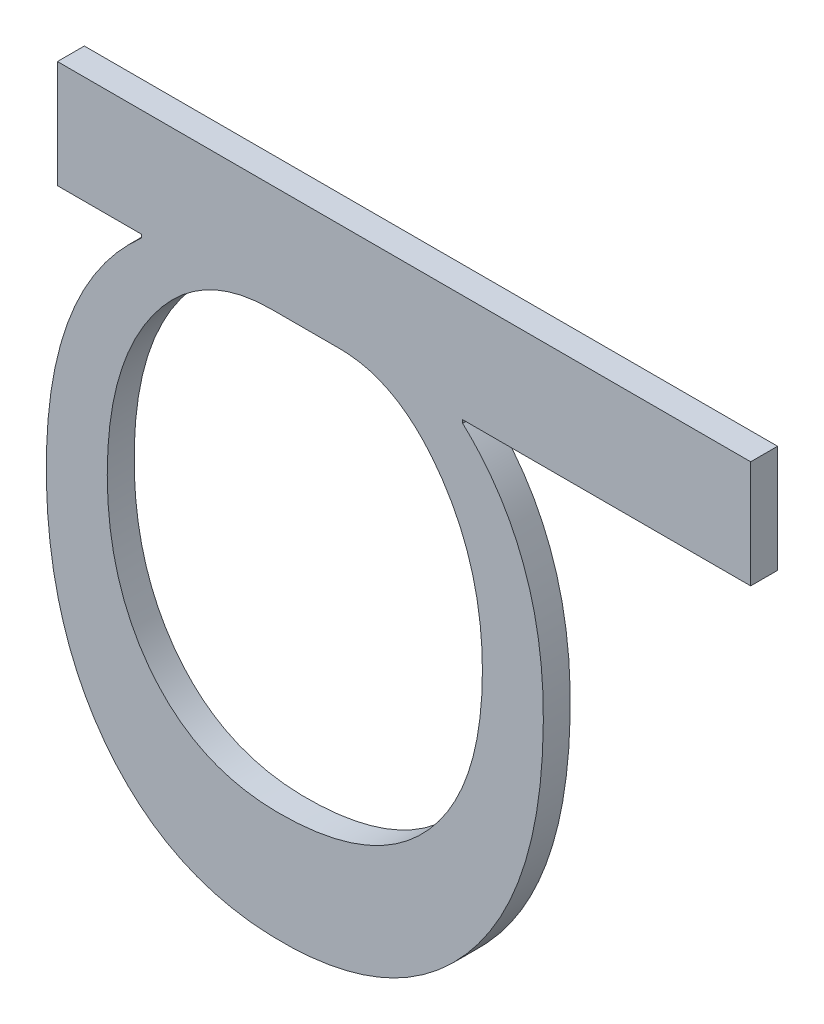
ISO-10303-21;
HEADER;
FILE_DESCRIPTION(('STEP AP214'),'2;1');
FILE_NAME('part.step','',(''),(''),'','','');
FILE_SCHEMA(('AUTOMOTIVE_DESIGN { 1 0 10303 214 1 1 1 1 }'));
ENDSEC;
DATA;
#1=APPLICATION_CONTEXT('core data for automotive mechanical design processes');
#2=APPLICATION_PROTOCOL_DEFINITION('international standard','automotive_design',2000,#1);
#3=PRODUCT_CONTEXT('',#1,'mechanical');
#4=PRODUCT('Part','Part','',(#3));
#5=PRODUCT_RELATED_PRODUCT_CATEGORY('part','',(#4));
#6=PRODUCT_DEFINITION_FORMATION('','',#4);
#7=PRODUCT_DEFINITION_CONTEXT('part definition',#1,'design');
#8=PRODUCT_DEFINITION('design','',#6,#7);
#9=PRODUCT_DEFINITION_SHAPE('','',#8);
#10=(LENGTH_UNIT() NAMED_UNIT(*) SI_UNIT(.MILLI.,.METRE.));
#11=(NAMED_UNIT(*) PLANE_ANGLE_UNIT() SI_UNIT($,.RADIAN.));
#12=(NAMED_UNIT(*) SI_UNIT($,.STERADIAN.) SOLID_ANGLE_UNIT());
#13=UNCERTAINTY_MEASURE_WITH_UNIT(LENGTH_MEASURE(1.E-05),#10,'distance_accuracy_value','');
#14=(GEOMETRIC_REPRESENTATION_CONTEXT(3) GLOBAL_UNCERTAINTY_ASSIGNED_CONTEXT((#13)) GLOBAL_UNIT_ASSIGNED_CONTEXT((#10,
#11,#12)) REPRESENTATION_CONTEXT('',''));
#15=CARTESIAN_POINT('',(0.,0.,0.));
#16=DIRECTION('',(0.,0.,1.));
#17=DIRECTION('',(1.,0.,0.));
#18=AXIS2_PLACEMENT_3D('',#15,#16,#17);
#19=CARTESIAN_POINT('',(-8.95983005625009,-22.770458436575,135.210489149433));
#20=DIRECTION('',(0.,0.,-1.));
#21=DIRECTION('',(0.,-1.,0.));
#22=AXIS2_PLACEMENT_3D('',#19,#20,#21);
#23=PLANE('',#22);
#24=DIRECTION('',(1.,0.,0.));
#25=VECTOR('',#24,1.);
#26=CARTESIAN_POINT('',(2.66453525910038E-13,24.9187466733,135.210489149433));
#27=LINE('',#26,#25);
#28=CARTESIAN_POINT('',(-7.19032697632218,24.9187466733,135.210489149433));
#29=VERTEX_POINT('',#28);
#30=CARTESIAN_POINT('',(-3.97696685012026,24.9187466733,135.210489149433));
#31=VERTEX_POINT('',#30);
#32=EDGE_CURVE('E48',#29,#31,#27,.T.);
#33=ORIENTED_EDGE('',*,*,#32,.T.);
#34=DIRECTION('',(0.,1.,0.));
#35=VECTOR('',#34,1.);
#36=CARTESIAN_POINT('',(-3.97696685012026,5.40908312699247,135.210489149433));
#37=LINE('',#36,#35);
#38=CARTESIAN_POINT('',(-3.97696685012026,26.1183691943336,135.210489149433));
#39=VERTEX_POINT('',#38);
#40=EDGE_CURVE('E54',#31,#39,#37,.T.);
#41=ORIENTED_EDGE('',*,*,#40,.T.);
#42=DIRECTION('',(-1.,0.,0.));
#43=VECTOR('',#42,1.);
#44=CARTESIAN_POINT('',(2.66453525910038E-13,26.1183691943336,135.210489149433));
#45=LINE('',#44,#43);
#46=CARTESIAN_POINT('',(-11.7110601493991,26.1183691943336,135.210489149433));
#47=VERTEX_POINT('',#46);
#48=EDGE_CURVE('E134',#39,#47,#45,.T.);
#49=ORIENTED_EDGE('',*,*,#48,.T.);
#50=DIRECTION('',(0.,-1.,0.));
#51=VECTOR('',#50,1.);
#52=CARTESIAN_POINT('',(-11.7110601493991,5.40908312699247,135.210489149433));
#53=LINE('',#52,#51);
#54=CARTESIAN_POINT('',(-11.7110601493991,24.9187466733,135.210489149433));
#55=VERTEX_POINT('',#54);
#56=EDGE_CURVE('E122',#47,#55,#53,.T.);
#57=ORIENTED_EDGE('',*,*,#56,.T.);
#58=DIRECTION('',(1.,0.,0.));
#59=VECTOR('',#58,1.);
#60=CARTESIAN_POINT('',(2.66453525910038E-13,24.9187466733,135.210489149433));
#61=LINE('',#60,#59);
#62=CARTESIAN_POINT('',(-10.7724333465145,24.9187466733,135.210489149433));
#63=VERTEX_POINT('',#62);
#64=EDGE_CURVE('E154',#55,#63,#61,.T.);
#65=ORIENTED_EDGE('',*,*,#64,.T.);
#66=DIRECTION('',(0.,-1.,0.));
#67=VECTOR('',#66,1.);
#68=CARTESIAN_POINT('',(-10.7724333465145,5.40908312699247,135.210489149433));
#69=LINE('',#68,#67);
#70=CARTESIAN_POINT('',(-10.7724333465145,24.882829831353,135.210489149433));
#71=VERTEX_POINT('',#70);
#72=EDGE_CURVE('E155',#63,#71,#69,.T.);
#73=ORIENTED_EDGE('',*,*,#72,.T.);
#74=CARTESIAN_POINT('',(-10.7724333465145,24.882829831353,135.210489149433));
#75=CARTESIAN_POINT('',(-11.4811923609376,24.2554824188768,135.210489149433));
#76=CARTESIAN_POINT('',(-11.8355718681491,23.338405627627,135.210489149433));
#77=CARTESIAN_POINT('',(-11.8355718681491,21.121139438492,135.210489149433));
#78=CARTESIAN_POINT('',(-11.6001172669569,20.3237851434588,135.210489149433));
#79=CARTESIAN_POINT('',(-10.6582974796157,19.1552911429867,135.210489149433));
#80=CARTESIAN_POINT('',(-10.0205741217549,18.8631666086159,135.210489149433));
#81=CARTESIAN_POINT('',(-8.33487700637026,18.863167682217,135.210489149433));
#82=CARTESIAN_POINT('',(-7.62691581837719,19.1900110856516,135.210489149433));
#83=CARTESIAN_POINT('',(-6.55739215658717,20.4973834296101,135.210489149433));
#84=CARTESIAN_POINT('',(-6.29001147151449,21.3821353437079,135.210489149433));
#85=CARTESIAN_POINT('',(-6.29001147151449,23.5323565741413,135.210489149433));
#86=CARTESIAN_POINT('',(-6.59011688920624,24.327316102771,135.210489149433));
#87=CARTESIAN_POINT('',(-7.19032697632218,24.882829831353,135.210489149433));
#88=(BOUNDED_CURVE() B_SPLINE_CURVE(3,(#74,#75,#76,#77,#78,#79,#80,#81,#82,#83,#84,#85,#86,#87),
.UNSPECIFIED.,.F.,.F.) B_SPLINE_CURVE_WITH_KNOTS((4,2,2,2,2,2,4),(0.,0.186607926762102,
0.342855021081848,0.49910207330936,0.670229816207461,0.841357743121363,1.),
.UNSPECIFIED.) CURVE() GEOMETRIC_REPRESENTATION_ITEM() RATIONAL_B_SPLINE_CURVE((1.,1.,1.,1.,1.,
1.,1.,1.,1.,1.,1.,1.,1.,1.)) REPRESENTATION_ITEM(''));
#89=CARTESIAN_POINT('',(-7.19032697632218,24.882829831353,135.210489149433));
#90=VERTEX_POINT('',#89);
#91=EDGE_CURVE('E11',#71,#90,#88,.T.);
#92=ORIENTED_EDGE('',*,*,#91,.T.);
#93=DIRECTION('',(0.,1.,0.));
#94=VECTOR('',#93,1.);
#95=CARTESIAN_POINT('',(-7.19032697632218,5.40908312699247,135.210489149433));
#96=LINE('',#95,#94);
#97=EDGE_CURVE('E165',#90,#29,#96,.T.);
#98=ORIENTED_EDGE('',*,*,#97,.T.);
#99=EDGE_LOOP('',(#33,#41,#49,#57,#65,#73,#92,#98));
#100=FACE_BOUND('',#99,.T.);
#101=CARTESIAN_POINT('',(-6.97003701237988,22.6057021132871,135.210489149433));
#102=CARTESIAN_POINT('',(-6.97003701237988,21.8251095406553,135.210489149433));
#103=CARTESIAN_POINT('',(-7.17117104828627,21.2109312927095,135.210489149433));
#104=CARTESIAN_POINT('',(-7.97570858689911,20.3154051378785,135.210489149433));
#105=CARTESIAN_POINT('',(-8.53122240901458,20.0915224493694,135.210489149433));
#106=CARTESIAN_POINT('',(-9.8369990270917,20.0915236768084,135.210489149433));
#107=CARTESIAN_POINT('',(-10.305515176333,20.3022353779087,135.210489149433));
#108=CARTESIAN_POINT('',(-10.9855395679336,21.1450841868568,135.210489149433));
#109=CARTESIAN_POINT('',(-11.1555466866488,21.7053869212319,135.210489149433));
#110=CARTESIAN_POINT('',(-11.1555459531499,23.1324825875304,135.210489149433));
#111=CARTESIAN_POINT('',(-10.9839434968293,23.733491428582,135.210489149433));
#112=CARTESIAN_POINT('',(-10.2975326313468,24.6816955164491,135.210489149433));
#113=CARTESIAN_POINT('',(-9.85934715959198,24.9187466733,135.210489149433));
#114=CARTESIAN_POINT('',(-9.0707732214423,24.9187466733,135.210489149433));
#115=CARTESIAN_POINT('',(-8.81536459877397,24.9187466733,135.210489149433));
#116=CARTESIAN_POINT('',(-8.11618309709198,24.9187466733,135.210489149433));
#117=CARTESIAN_POINT('',(-7.74025361599626,24.6960621624114,135.210489149433));
#118=CARTESIAN_POINT('',(-7.12408060615335,23.8053248535398,135.210489149433));
#119=CARTESIAN_POINT('',(-6.97003701237988,23.2569944933472,135.210489149433));
#120=CARTESIAN_POINT('',(-6.97003701237988,22.6057021132871,135.210489149433));
#121=(BOUNDED_CURVE() B_SPLINE_CURVE(3,(#101,#102,#103,#104,#105,#106,#107,#108,#109,#110,#111,
#112,#113,#114,#115,#116,#117,#118,#119,#120),.UNSPECIFIED.,.T.,
.F.) B_SPLINE_CURVE_WITH_KNOTS((4,2,2,2,2,2,2,2,2,4),(0.,0.136638925353513,0.27327775593979,
0.388374412813432,0.503471205427693,0.623298083400434,0.743125097738412,0.800527280141993,
0.900263661321193,1.),
.UNSPECIFIED.) CURVE() GEOMETRIC_REPRESENTATION_ITEM() RATIONAL_B_SPLINE_CURVE((1.,1.,1.,1.,1.,
1.,1.,1.,1.,1.,1.,1.,1.,1.,1.,1.,1.,1.,1.,1.)) REPRESENTATION_ITEM(''));
#122=CARTESIAN_POINT('',(-6.97003701237988,22.6057021132871,135.210489149433));
#123=VERTEX_POINT('',#122);
#124=EDGE_CURVE('E89',#123,#123,#121,.T.);
#125=ORIENTED_EDGE('',*,*,#124,.T.);
#126=EDGE_LOOP('',(#125));
#127=FACE_BOUND('',#126,.T.);
#128=ADVANCED_FACE('F43',(#100,#127),#23,.F.);
#129=CARTESIAN_POINT('',(-10.7724333465145,24.882829831353,135.410489149433));
#130=CARTESIAN_POINT('',(-11.4811923609376,24.2554824188768,135.410489149433));
#131=CARTESIAN_POINT('',(-11.8355718681491,23.338405627627,135.410489149433));
#132=CARTESIAN_POINT('',(-11.8355718681491,21.121139438492,135.410489149433));
#133=CARTESIAN_POINT('',(-11.6001172669569,20.3237851434588,135.410489149433));
#134=CARTESIAN_POINT('',(-10.6582974796157,19.1552911429867,135.410489149433));
#135=CARTESIAN_POINT('',(-10.0205741217549,18.8631666086159,135.410489149433));
#136=CARTESIAN_POINT('',(-8.33487700637026,18.863167682217,135.410489149433));
#137=CARTESIAN_POINT('',(-7.62691581837719,19.1900110856516,135.410489149433));
#138=CARTESIAN_POINT('',(-6.55739215658717,20.4973834296101,135.410489149433));
#139=CARTESIAN_POINT('',(-6.29001147151449,21.3821353437079,135.410489149433));
#140=CARTESIAN_POINT('',(-6.29001147151449,23.5323565741413,135.410489149433));
#141=CARTESIAN_POINT('',(-6.59011688920624,24.327316102771,135.410489149433));
#142=CARTESIAN_POINT('',(-7.19032697632218,24.882829831353,135.410489149433));
#143=(BOUNDED_CURVE() B_SPLINE_CURVE(3,(#129,#130,#131,#132,#133,#134,#135,#136,#137,#138,#139,
#140,#141,#142),.UNSPECIFIED.,.F.,.F.) B_SPLINE_CURVE_WITH_KNOTS((4,2,2,2,2,2,4),(0.,
0.186607926762102,0.342855021081848,0.49910207330936,0.670229816207461,0.841357743121363,1.),
.UNSPECIFIED.) CURVE() GEOMETRIC_REPRESENTATION_ITEM() RATIONAL_B_SPLINE_CURVE((1.,1.,1.,1.,1.,
1.,1.,1.,1.,1.,1.,1.,1.,1.)) REPRESENTATION_ITEM(''));
#144=DIRECTION('',(0.,0.,-1.));
#145=VECTOR('',#144,1.);
#146=SURFACE_OF_LINEAR_EXTRUSION('',#143,#145);
#147=ORIENTED_EDGE('',*,*,#91,.F.);
#148=CARTESIAN_POINT('',(-10.7724333465145,24.882829831353,134.910489149433));
#149=CARTESIAN_POINT('',(-10.7724333465145,24.882829831353,135.010489149433));
#150=CARTESIAN_POINT('',(-10.7724333465145,24.882829831353,135.110489149433));
#151=CARTESIAN_POINT('',(-10.7724333465145,24.882829831353,135.210489149433));
#152=(BOUNDED_CURVE() B_SPLINE_CURVE(3,(#148,#149,#150,#151),.UNSPECIFIED.,.F.,
.F.) B_SPLINE_CURVE_WITH_KNOTS((4,4),(0.,1.),
.UNSPECIFIED.) CURVE() GEOMETRIC_REPRESENTATION_ITEM() RATIONAL_B_SPLINE_CURVE((1.,1.,1.,1.)) REPRESENTATION_ITEM(''));
#153=CARTESIAN_POINT('',(-10.7724333465145,24.882829831353,134.910489149433));
#154=VERTEX_POINT('',#153);
#155=EDGE_CURVE('E160',#154,#71,#152,.T.);
#156=ORIENTED_EDGE('',*,*,#155,.F.);
#157=CARTESIAN_POINT('',(-7.19032697632218,24.882829831353,134.910489149433));
#158=CARTESIAN_POINT('',(-6.59011688920624,24.327316102771,134.910489149433));
#159=CARTESIAN_POINT('',(-6.29001147151449,23.5323565741413,134.910489149433));
#160=CARTESIAN_POINT('',(-6.29001147151449,21.3821353437079,134.910489149433));
#161=CARTESIAN_POINT('',(-6.55739215658717,20.4973834296101,134.910489149433));
#162=CARTESIAN_POINT('',(-7.62691581837719,19.1900110856516,134.910489149433));
#163=CARTESIAN_POINT('',(-8.33487700637026,18.863167682217,134.910489149433));
#164=CARTESIAN_POINT('',(-10.0205741217549,18.8631666086159,134.910489149433));
#165=CARTESIAN_POINT('',(-10.6582974796157,19.1552911429867,134.910489149433));
#166=CARTESIAN_POINT('',(-11.6001172669569,20.3237851434588,134.910489149433));
#167=CARTESIAN_POINT('',(-11.8355718681491,21.121139438492,134.910489149433));
#168=CARTESIAN_POINT('',(-11.8355718681491,23.338405627627,134.910489149433));
#169=CARTESIAN_POINT('',(-11.4811923609376,24.2554824188768,134.910489149433));
#170=CARTESIAN_POINT('',(-10.7724333465145,24.882829831353,134.910489149433));
#171=(BOUNDED_CURVE() B_SPLINE_CURVE(3,(#157,#158,#159,#160,#161,#162,#163,#164,#165,#166,#167,
#168,#169,#170),.UNSPECIFIED.,.F.,.F.) B_SPLINE_CURVE_WITH_KNOTS((4,2,2,2,2,2,4),(0.,
0.158642256878637,0.329770183792539,0.50089792669064,0.657144978918152,0.813392073237898,1.),
.UNSPECIFIED.) CURVE() GEOMETRIC_REPRESENTATION_ITEM() RATIONAL_B_SPLINE_CURVE((1.,1.,1.,1.,1.,
1.,1.,1.,1.,1.,1.,1.,1.,1.)) REPRESENTATION_ITEM(''));
#172=CARTESIAN_POINT('',(-7.19032697632218,24.882829831353,134.910489149433));
#173=VERTEX_POINT('',#172);
#174=EDGE_CURVE('E203',#173,#154,#171,.T.);
#175=ORIENTED_EDGE('',*,*,#174,.F.);
#176=CARTESIAN_POINT('',(-7.19032697632218,24.882829831353,135.210489149433));
#177=CARTESIAN_POINT('',(-7.19032697632218,24.882829831353,135.110489149433));
#178=CARTESIAN_POINT('',(-7.19032697632218,24.882829831353,135.010489149433));
#179=CARTESIAN_POINT('',(-7.19032697632218,24.882829831353,134.910489149433));
#180=(BOUNDED_CURVE() B_SPLINE_CURVE(3,(#176,#177,#178,#179),.UNSPECIFIED.,.F.,
.F.) B_SPLINE_CURVE_WITH_KNOTS((4,4),(0.,1.),
.UNSPECIFIED.) CURVE() GEOMETRIC_REPRESENTATION_ITEM() RATIONAL_B_SPLINE_CURVE((1.,1.,1.,1.)) REPRESENTATION_ITEM(''));
#181=EDGE_CURVE('E191',#90,#173,#180,.T.);
#182=ORIENTED_EDGE('',*,*,#181,.F.);
#183=EDGE_LOOP('',(#147,#156,#175,#182));
#184=FACE_BOUND('',#183,.T.);
#185=ADVANCED_FACE('F45',(#184),#146,.F.);
#186=CARTESIAN_POINT('',(-3.97696685012026,26.1183691943336,135.410489149433));
#187=DIRECTION('',(1.,0.,0.));
#188=DIRECTION('',(0.,1.,0.));
#189=AXIS2_PLACEMENT_3D('',#186,#187,#188);
#190=PLANE('',#189);
#191=ORIENTED_EDGE('',*,*,#40,.F.);
#192=CARTESIAN_POINT('',(-3.97696685012026,24.9187466733001,135.210489149433));
#193=CARTESIAN_POINT('',(-3.97696685012026,24.9187466733001,135.110489149433));
#194=CARTESIAN_POINT('',(-3.97696685012026,24.9187466733001,135.010489149433));
#195=CARTESIAN_POINT('',(-3.97696685012026,24.9187466733001,134.910489149433));
#196=(BOUNDED_CURVE() B_SPLINE_CURVE(3,(#192,#193,#194,#195),.UNSPECIFIED.,.F.,
.F.) B_SPLINE_CURVE_WITH_KNOTS((4,4),(0.,1.),
.UNSPECIFIED.) CURVE() GEOMETRIC_REPRESENTATION_ITEM() RATIONAL_B_SPLINE_CURVE((1.,1.,1.,1.)) REPRESENTATION_ITEM(''));
#197=CARTESIAN_POINT('',(-3.97696685012026,24.9187466733,134.910489149433));
#198=VERTEX_POINT('',#197);
#199=EDGE_CURVE('E202',#31,#198,#196,.T.);
#200=ORIENTED_EDGE('',*,*,#199,.T.);
#201=CARTESIAN_POINT('',(-3.97696685012026,26.1183691943336,134.910489149433));
#202=CARTESIAN_POINT('',(-3.97696685012026,25.7184950206559,134.910489149433));
#203=CARTESIAN_POINT('',(-3.97696685012026,25.318620846978,134.910489149433));
#204=CARTESIAN_POINT('',(-3.97696685012026,24.9187466733,134.910489149433));
#205=(BOUNDED_CURVE() B_SPLINE_CURVE(3,(#201,#202,#203,#204),.UNSPECIFIED.,.F.,
.F.) B_SPLINE_CURVE_WITH_KNOTS((4,4),(0.,1.),
.UNSPECIFIED.) CURVE() GEOMETRIC_REPRESENTATION_ITEM() RATIONAL_B_SPLINE_CURVE((1.,1.,1.,1.)) REPRESENTATION_ITEM(''));
#206=CARTESIAN_POINT('',(-3.97696685012026,26.1183691943336,134.910489149433));
#207=VERTEX_POINT('',#206);
#208=EDGE_CURVE('E176',#207,#198,#205,.T.);
#209=ORIENTED_EDGE('',*,*,#208,.F.);
#210=CARTESIAN_POINT('',(-3.97696685012026,26.1183691943336,135.210489149433));
#211=CARTESIAN_POINT('',(-3.97696685012026,26.1183691943336,135.110489149433));
#212=CARTESIAN_POINT('',(-3.97696685012026,26.1183691943336,135.010489149433));
#213=CARTESIAN_POINT('',(-3.97696685012026,26.1183691943336,134.910489149433));
#214=(BOUNDED_CURVE() B_SPLINE_CURVE(3,(#210,#211,#212,#213),.UNSPECIFIED.,.F.,
.F.) B_SPLINE_CURVE_WITH_KNOTS((4,4),(0.,1.),
.UNSPECIFIED.) CURVE() GEOMETRIC_REPRESENTATION_ITEM() RATIONAL_B_SPLINE_CURVE((1.,1.,1.,1.)) REPRESENTATION_ITEM(''));
#215=EDGE_CURVE('E126',#39,#207,#214,.T.);
#216=ORIENTED_EDGE('',*,*,#215,.F.);
#217=EDGE_LOOP('',(#191,#200,#209,#216));
#218=FACE_BOUND('',#217,.T.);
#219=ADVANCED_FACE('F287',(#218),#190,.T.);
#220=CARTESIAN_POINT('',(-3.97696685012026,24.9187466733,135.410489149433));
#221=DIRECTION('',(0.,-1.,0.));
#222=DIRECTION('',(0.,0.,-1.));
#223=AXIS2_PLACEMENT_3D('',#220,#221,#222);
#224=PLANE('',#223);
#225=ORIENTED_EDGE('',*,*,#32,.F.);
#226=CARTESIAN_POINT('',(-7.19032697632218,24.9187466733,135.210489149433));
#227=CARTESIAN_POINT('',(-7.19032697632218,24.9187466733,135.110489149433));
#228=CARTESIAN_POINT('',(-7.19032697632218,24.9187466733,135.010489149433));
#229=CARTESIAN_POINT('',(-7.19032697632218,24.9187466733,134.910489149433));
#230=(BOUNDED_CURVE() B_SPLINE_CURVE(3,(#226,#227,#228,#229),.UNSPECIFIED.,.F.,
.F.) B_SPLINE_CURVE_WITH_KNOTS((4,4),(0.,1.),
.UNSPECIFIED.) CURVE() GEOMETRIC_REPRESENTATION_ITEM() RATIONAL_B_SPLINE_CURVE((1.,1.,1.,1.)) REPRESENTATION_ITEM(''));
#231=CARTESIAN_POINT('',(-7.19032697632218,24.9187466733,134.910489149433));
#232=VERTEX_POINT('',#231);
#233=EDGE_CURVE('E184',#29,#232,#230,.T.);
#234=ORIENTED_EDGE('',*,*,#233,.T.);
#235=CARTESIAN_POINT('',(-3.97696685012026,24.9187466733,134.910489149433));
#236=CARTESIAN_POINT('',(-5.04808689218757,24.9187466733,134.910489149433));
#237=CARTESIAN_POINT('',(-6.11920693425488,24.9187466733,134.910489149433));
#238=CARTESIAN_POINT('',(-7.19032697632218,24.9187466733,134.910489149433));
#239=(BOUNDED_CURVE() B_SPLINE_CURVE(3,(#235,#236,#237,#238),.UNSPECIFIED.,.F.,
.F.) B_SPLINE_CURVE_WITH_KNOTS((4,4),(0.,1.),
.UNSPECIFIED.) CURVE() GEOMETRIC_REPRESENTATION_ITEM() RATIONAL_B_SPLINE_CURVE((1.,1.,1.,1.)) REPRESENTATION_ITEM(''));
#240=EDGE_CURVE('E183',#198,#232,#239,.T.);
#241=ORIENTED_EDGE('',*,*,#240,.F.);
#242=ORIENTED_EDGE('',*,*,#199,.F.);
#243=EDGE_LOOP('',(#225,#234,#241,#242));
#244=FACE_BOUND('',#243,.T.);
#245=ADVANCED_FACE('F277',(#244),#224,.T.);
#246=CARTESIAN_POINT('',(-7.19032697632218,24.9187466733,135.410489149433));
#247=DIRECTION('',(1.,0.,0.));
#248=DIRECTION('',(0.,1.,0.));
#249=AXIS2_PLACEMENT_3D('',#246,#247,#248);
#250=PLANE('',#249);
#251=ORIENTED_EDGE('',*,*,#97,.F.);
#252=ORIENTED_EDGE('',*,*,#181,.T.);
#253=CARTESIAN_POINT('',(-7.19032697632218,24.9187466733,134.910489149433));
#254=CARTESIAN_POINT('',(-7.19032697632218,24.9067743926509,134.910489149433));
#255=CARTESIAN_POINT('',(-7.19032697632218,24.894802112002,134.910489149433));
#256=CARTESIAN_POINT('',(-7.19032697632218,24.882829831353,134.910489149433));
#257=(BOUNDED_CURVE() B_SPLINE_CURVE(3,(#253,#254,#255,#256),.UNSPECIFIED.,.F.,
.F.) B_SPLINE_CURVE_WITH_KNOTS((4,4),(0.,1.),
.UNSPECIFIED.) CURVE() GEOMETRIC_REPRESENTATION_ITEM() RATIONAL_B_SPLINE_CURVE((1.,1.,1.,1.)) REPRESENTATION_ITEM(''));
#258=EDGE_CURVE('E207',#232,#173,#257,.T.);
#259=ORIENTED_EDGE('',*,*,#258,.F.);
#260=ORIENTED_EDGE('',*,*,#233,.F.);
#261=EDGE_LOOP('',(#251,#252,#259,#260));
#262=FACE_BOUND('',#261,.T.);
#263=ADVANCED_FACE('F278',(#262),#250,.T.);
#264=CARTESIAN_POINT('',(-10.7724333465145,24.882829831353,135.410489149433));
#265=DIRECTION('',(-1.,0.,0.));
#266=DIRECTION('',(0.,0.,1.));
#267=AXIS2_PLACEMENT_3D('',#264,#265,#266);
#268=PLANE('',#267);
#269=ORIENTED_EDGE('',*,*,#72,.F.);
#270=CARTESIAN_POINT('',(-10.7724333465145,24.9187466733,135.210489149433));
#271=CARTESIAN_POINT('',(-10.7724333465145,24.9187466733,135.110489149433));
#272=CARTESIAN_POINT('',(-10.7724333465145,24.9187466733,135.010489149433));
#273=CARTESIAN_POINT('',(-10.7724333465145,24.9187466733,134.910489149433));
#274=(BOUNDED_CURVE() B_SPLINE_CURVE(3,(#270,#271,#272,#273),.UNSPECIFIED.,.F.,
.F.) B_SPLINE_CURVE_WITH_KNOTS((4,4),(0.,1.),
.UNSPECIFIED.) CURVE() GEOMETRIC_REPRESENTATION_ITEM() RATIONAL_B_SPLINE_CURVE((1.,1.,1.,1.)) REPRESENTATION_ITEM(''));
#275=CARTESIAN_POINT('',(-10.7724333465145,24.9187466733,134.910489149433));
#276=VERTEX_POINT('',#275);
#277=EDGE_CURVE('E161',#63,#276,#274,.T.);
#278=ORIENTED_EDGE('',*,*,#277,.T.);
#279=CARTESIAN_POINT('',(-10.7724333465145,24.882829831353,134.910489149433));
#280=CARTESIAN_POINT('',(-10.7724333465145,24.894802112002,134.910489149433));
#281=CARTESIAN_POINT('',(-10.7724333465145,24.9067743926509,134.910489149433));
#282=CARTESIAN_POINT('',(-10.7724333465145,24.9187466733,134.910489149433));
#283=(BOUNDED_CURVE() B_SPLINE_CURVE(3,(#279,#280,#281,#282),.UNSPECIFIED.,.F.,
.F.) B_SPLINE_CURVE_WITH_KNOTS((4,4),(0.,1.),
.UNSPECIFIED.) CURVE() GEOMETRIC_REPRESENTATION_ITEM() RATIONAL_B_SPLINE_CURVE((1.,1.,1.,1.)) REPRESENTATION_ITEM(''));
#284=EDGE_CURVE('E141',#154,#276,#283,.T.);
#285=ORIENTED_EDGE('',*,*,#284,.F.);
#286=ORIENTED_EDGE('',*,*,#155,.T.);
#287=EDGE_LOOP('',(#269,#278,#285,#286));
#288=FACE_BOUND('',#287,.T.);
#289=ADVANCED_FACE('F251',(#288),#268,.T.);
#290=CARTESIAN_POINT('',(-10.7724333465145,24.9187466733,135.410489149433));
#291=DIRECTION('',(0.,-1.,0.));
#292=DIRECTION('',(0.,0.,-1.));
#293=AXIS2_PLACEMENT_3D('',#290,#291,#292);
#294=PLANE('',#293);
#295=ORIENTED_EDGE('',*,*,#64,.F.);
#296=CARTESIAN_POINT('',(-11.7110601493991,24.9187466733,135.210489149433));
#297=CARTESIAN_POINT('',(-11.7110601493991,24.9187466733,135.110489149433));
#298=CARTESIAN_POINT('',(-11.7110601493991,24.9187466733,135.010489149433));
#299=CARTESIAN_POINT('',(-11.7110601493991,24.9187466733,134.910489149433));
#300=(BOUNDED_CURVE() B_SPLINE_CURVE(3,(#296,#297,#298,#299),.UNSPECIFIED.,.F.,
.F.) B_SPLINE_CURVE_WITH_KNOTS((4,4),(0.,1.),
.UNSPECIFIED.) CURVE() GEOMETRIC_REPRESENTATION_ITEM() RATIONAL_B_SPLINE_CURVE((1.,1.,1.,1.)) REPRESENTATION_ITEM(''));
#301=CARTESIAN_POINT('',(-11.7110601493991,24.9187466733,134.910489149433));
#302=VERTEX_POINT('',#301);
#303=EDGE_CURVE('E148',#55,#302,#300,.T.);
#304=ORIENTED_EDGE('',*,*,#303,.T.);
#305=CARTESIAN_POINT('',(-10.7724333465145,24.9187466733,134.910489149433));
#306=CARTESIAN_POINT('',(-11.085308947476,24.9187466733,134.910489149433));
#307=CARTESIAN_POINT('',(-11.3981845484376,24.9187466733,134.910489149433));
#308=CARTESIAN_POINT('',(-11.7110601493991,24.9187466733,134.910489149433));
#309=(BOUNDED_CURVE() B_SPLINE_CURVE(3,(#305,#306,#307,#308),.UNSPECIFIED.,.F.,
.F.) B_SPLINE_CURVE_WITH_KNOTS((4,4),(0.,1.),
.UNSPECIFIED.) CURVE() GEOMETRIC_REPRESENTATION_ITEM() RATIONAL_B_SPLINE_CURVE((1.,1.,1.,1.)) REPRESENTATION_ITEM(''));
#310=EDGE_CURVE('E139',#276,#302,#309,.T.);
#311=ORIENTED_EDGE('',*,*,#310,.F.);
#312=ORIENTED_EDGE('',*,*,#277,.F.);
#313=EDGE_LOOP('',(#295,#304,#311,#312));
#314=FACE_BOUND('',#313,.T.);
#315=ADVANCED_FACE('F249',(#314),#294,.T.);
#316=CARTESIAN_POINT('',(-11.7110601493991,24.9187466733,135.410489149433));
#317=DIRECTION('',(-1.,0.,0.));
#318=DIRECTION('',(0.,0.,1.));
#319=AXIS2_PLACEMENT_3D('',#316,#317,#318);
#320=PLANE('',#319);
#321=ORIENTED_EDGE('',*,*,#56,.F.);
#322=CARTESIAN_POINT('',(-11.7110601493991,26.1183691943336,135.210489149433));
#323=CARTESIAN_POINT('',(-11.7110601493991,26.1183691943336,135.110489149433));
#324=CARTESIAN_POINT('',(-11.7110601493991,26.1183691943336,135.010489149433));
#325=CARTESIAN_POINT('',(-11.7110601493991,26.1183691943336,134.910489149433));
#326=(BOUNDED_CURVE() B_SPLINE_CURVE(3,(#322,#323,#324,#325),.UNSPECIFIED.,.F.,
.F.) B_SPLINE_CURVE_WITH_KNOTS((4,4),(0.,1.),
.UNSPECIFIED.) CURVE() GEOMETRIC_REPRESENTATION_ITEM() RATIONAL_B_SPLINE_CURVE((1.,1.,1.,1.)) REPRESENTATION_ITEM(''));
#327=CARTESIAN_POINT('',(-11.7110601493991,26.1183691943336,134.910489149433));
#328=VERTEX_POINT('',#327);
#329=EDGE_CURVE('E114',#47,#328,#326,.T.);
#330=ORIENTED_EDGE('',*,*,#329,.T.);
#331=CARTESIAN_POINT('',(-11.7110601493991,24.9187466733,134.910489149433));
#332=CARTESIAN_POINT('',(-11.7110601493991,25.318620846978,134.910489149433));
#333=CARTESIAN_POINT('',(-11.7110601493991,25.7184950206559,134.910489149433));
#334=CARTESIAN_POINT('',(-11.7110601493991,26.1183691943336,134.910489149433));
#335=(BOUNDED_CURVE() B_SPLINE_CURVE(3,(#331,#332,#333,#334),.UNSPECIFIED.,.F.,
.F.) B_SPLINE_CURVE_WITH_KNOTS((4,4),(0.,1.),
.UNSPECIFIED.) CURVE() GEOMETRIC_REPRESENTATION_ITEM() RATIONAL_B_SPLINE_CURVE((1.,1.,1.,1.)) REPRESENTATION_ITEM(''));
#336=EDGE_CURVE('E119',#302,#328,#335,.T.);
#337=ORIENTED_EDGE('',*,*,#336,.F.);
#338=ORIENTED_EDGE('',*,*,#303,.F.);
#339=EDGE_LOOP('',(#321,#330,#337,#338));
#340=FACE_BOUND('',#339,.T.);
#341=ADVANCED_FACE('F116',(#340),#320,.T.);
#342=CARTESIAN_POINT('',(-11.7110601493991,26.1183691943336,135.410489149433));
#343=DIRECTION('',(0.,1.,0.));
#344=DIRECTION('',(1.,0.,0.));
#345=AXIS2_PLACEMENT_3D('',#342,#343,#344);
#346=PLANE('',#345);
#347=ORIENTED_EDGE('',*,*,#48,.F.);
#348=ORIENTED_EDGE('',*,*,#215,.T.);
#349=CARTESIAN_POINT('',(-11.7110601493991,26.1183691943336,134.910489149433));
#350=CARTESIAN_POINT('',(-9.13302904963949,26.1183691943336,134.910489149433));
#351=CARTESIAN_POINT('',(-6.55499794987988,26.1183691943336,134.910489149433));
#352=CARTESIAN_POINT('',(-3.97696685012026,26.1183691943336,134.910489149433));
#353=(BOUNDED_CURVE() B_SPLINE_CURVE(3,(#349,#350,#351,#352),.UNSPECIFIED.,.F.,
.F.) B_SPLINE_CURVE_WITH_KNOTS((4,4),(0.,1.),
.UNSPECIFIED.) CURVE() GEOMETRIC_REPRESENTATION_ITEM() RATIONAL_B_SPLINE_CURVE((1.,1.,1.,1.)) REPRESENTATION_ITEM(''));
#354=EDGE_CURVE('E129',#328,#207,#353,.T.);
#355=ORIENTED_EDGE('',*,*,#354,.F.);
#356=ORIENTED_EDGE('',*,*,#329,.F.);
#357=EDGE_LOOP('',(#347,#348,#355,#356));
#358=FACE_BOUND('',#357,.T.);
#359=ADVANCED_FACE('F130',(#358),#346,.T.);
#360=CARTESIAN_POINT('',(-9.20218057646048,18.8631941259579,134.910489149433));
#361=DIRECTION('',(0.,0.,1.));
#362=DIRECTION('',(1.,0.,0.));
#363=AXIS2_PLACEMENT_3D('',#360,#361,#362);
#364=PLANE('',#363);
#365=ORIENTED_EDGE('',*,*,#208,.T.);
#366=ORIENTED_EDGE('',*,*,#240,.T.);
#367=ORIENTED_EDGE('',*,*,#258,.T.);
#368=ORIENTED_EDGE('',*,*,#174,.T.);
#369=ORIENTED_EDGE('',*,*,#284,.T.);
#370=ORIENTED_EDGE('',*,*,#310,.T.);
#371=ORIENTED_EDGE('',*,*,#336,.T.);
#372=ORIENTED_EDGE('',*,*,#354,.T.);
#373=EDGE_LOOP('',(#365,#366,#367,#368,#369,#370,#371,#372));
#374=FACE_BOUND('',#373,.T.);
#375=CARTESIAN_POINT('',(-6.97003701237988,22.6057021132871,134.910489149433));
#376=CARTESIAN_POINT('',(-6.97003701237988,23.2569944933472,134.910489149433));
#377=CARTESIAN_POINT('',(-7.12408060615335,23.8053248535398,134.910489149433));
#378=CARTESIAN_POINT('',(-7.74025361599626,24.6960621624114,134.910489149433));
#379=CARTESIAN_POINT('',(-8.11618309709198,24.9187466733,134.910489149433));
#380=CARTESIAN_POINT('',(-8.81536459877397,24.9187466733,134.910489149433));
#381=CARTESIAN_POINT('',(-9.0707732214423,24.9187466733,134.910489149433));
#382=CARTESIAN_POINT('',(-9.85934715959198,24.9187466733,134.910489149433));
#383=CARTESIAN_POINT('',(-10.2975326313468,24.6816955164491,134.910489149433));
#384=CARTESIAN_POINT('',(-10.9839434968293,23.733491428582,134.910489149433));
#385=CARTESIAN_POINT('',(-11.1555459531499,23.1324825875304,134.910489149433));
#386=CARTESIAN_POINT('',(-11.1555466866488,21.7053869212319,134.910489149433));
#387=CARTESIAN_POINT('',(-10.9855395679336,21.1450841868568,134.910489149433));
#388=CARTESIAN_POINT('',(-10.305515176333,20.3022353779087,134.910489149433));
#389=CARTESIAN_POINT('',(-9.8369990270917,20.0915236768084,134.910489149433));
#390=CARTESIAN_POINT('',(-8.53122240901458,20.0915224493694,134.910489149433));
#391=CARTESIAN_POINT('',(-7.97570858689911,20.3154051378785,134.910489149433));
#392=CARTESIAN_POINT('',(-7.17117104828627,21.2109312927095,134.910489149433));
#393=CARTESIAN_POINT('',(-6.97003701237988,21.8251095406553,134.910489149433));
#394=CARTESIAN_POINT('',(-6.97003701237988,22.6057021132871,134.910489149433));
#395=(BOUNDED_CURVE() B_SPLINE_CURVE(3,(#375,#376,#377,#378,#379,#380,#381,#382,#383,#384,#385,
#386,#387,#388,#389,#390,#391,#392,#393,#394),.UNSPECIFIED.,.T.,
.F.) B_SPLINE_CURVE_WITH_KNOTS((4,2,2,2,2,2,2,2,2,4),(0.,0.099736338678807,0.199472719858007,
0.256874902261588,0.376701916599566,0.496528794572307,0.611625587186568,0.72672224406021,
0.863361074646487,1.),
.UNSPECIFIED.) CURVE() GEOMETRIC_REPRESENTATION_ITEM() RATIONAL_B_SPLINE_CURVE((1.,1.,1.,1.,1.,
1.,1.,1.,1.,1.,1.,1.,1.,1.,1.,1.,1.,1.,1.,1.)) REPRESENTATION_ITEM(''));
#396=CARTESIAN_POINT('',(-6.97003701237988,22.6057021132871,134.910489149433));
#397=VERTEX_POINT('',#396);
#398=EDGE_CURVE('E97',#397,#397,#395,.T.);
#399=ORIENTED_EDGE('',*,*,#398,.T.);
#400=EDGE_LOOP('',(#399));
#401=FACE_BOUND('',#400,.T.);
#402=ADVANCED_FACE('F136',(#374,#401),#364,.F.);
#403=CARTESIAN_POINT('',(-6.97003701237988,22.6057021132871,135.410489149433));
#404=CARTESIAN_POINT('',(-6.97003701237988,21.8251095406553,135.410489149433));
#405=CARTESIAN_POINT('',(-7.17117104828627,21.2109312927095,135.410489149433));
#406=CARTESIAN_POINT('',(-7.97570858689911,20.3154051378785,135.410489149433));
#407=CARTESIAN_POINT('',(-8.53122240901458,20.0915224493694,135.410489149433));
#408=CARTESIAN_POINT('',(-9.8369990270917,20.0915236768084,135.410489149433));
#409=CARTESIAN_POINT('',(-10.305515176333,20.3022353779087,135.410489149433));
#410=CARTESIAN_POINT('',(-10.9855395679336,21.1450841868568,135.410489149433));
#411=CARTESIAN_POINT('',(-11.1555466866488,21.7053869212319,135.410489149433));
#412=CARTESIAN_POINT('',(-11.1555459531499,23.1324825875304,135.410489149433));
#413=CARTESIAN_POINT('',(-10.9839434968293,23.733491428582,135.410489149433));
#414=CARTESIAN_POINT('',(-10.2975326313468,24.6816955164491,135.410489149433));
#415=CARTESIAN_POINT('',(-9.85934715959198,24.9187466733,135.410489149433));
#416=CARTESIAN_POINT('',(-9.0707732214423,24.9187466733,135.410489149433));
#417=CARTESIAN_POINT('',(-8.81536459877397,24.9187466733,135.410489149433));
#418=CARTESIAN_POINT('',(-8.11618309709198,24.9187466733,135.410489149433));
#419=CARTESIAN_POINT('',(-7.74025361599626,24.6960621624114,135.410489149433));
#420=CARTESIAN_POINT('',(-7.12408060615335,23.8053248535398,135.410489149433));
#421=CARTESIAN_POINT('',(-6.97003701237988,23.2569944933472,135.410489149433));
#422=CARTESIAN_POINT('',(-6.97003701237988,22.6057021132871,135.410489149433));
#423=(BOUNDED_CURVE() B_SPLINE_CURVE(3,(#403,#404,#405,#406,#407,#408,#409,#410,#411,#412,#413,
#414,#415,#416,#417,#418,#419,#420,#421,#422),.UNSPECIFIED.,.T.,
.F.) B_SPLINE_CURVE_WITH_KNOTS((4,2,2,2,2,2,2,2,2,4),(0.,0.136638925353513,0.27327775593979,
0.388374412813432,0.503471205427693,0.623298083400434,0.743125097738412,0.800527280141993,
0.900263661321193,1.),
.UNSPECIFIED.) CURVE() GEOMETRIC_REPRESENTATION_ITEM() RATIONAL_B_SPLINE_CURVE((1.,1.,1.,1.,1.,
1.,1.,1.,1.,1.,1.,1.,1.,1.,1.,1.,1.,1.,1.,1.)) REPRESENTATION_ITEM(''));
#424=DIRECTION('',(0.,0.,-1.));
#425=VECTOR('',#424,1.);
#426=SURFACE_OF_LINEAR_EXTRUSION('',#423,#425);
#427=ORIENTED_EDGE('',*,*,#124,.F.);
#428=EDGE_LOOP('',(#427));
#429=FACE_BOUND('',#428,.T.);
#430=ORIENTED_EDGE('',*,*,#398,.F.);
#431=EDGE_LOOP('',(#430));
#432=FACE_BOUND('',#431,.T.);
#433=ADVANCED_FACE('F299',(#429,#432),#426,.F.);
#434=CLOSED_SHELL('',(#128,#185,#219,#245,#263,#289,#315,#341,#359,#402,#433));
#435=MANIFOLD_SOLID_BREP('B2',#434);
#436=ADVANCED_BREP_SHAPE_REPRESENTATION('',(#18,#435),#14);
#437=SHAPE_DEFINITION_REPRESENTATION(#9,#436);
ENDSEC;
END-ISO-10303-21;
